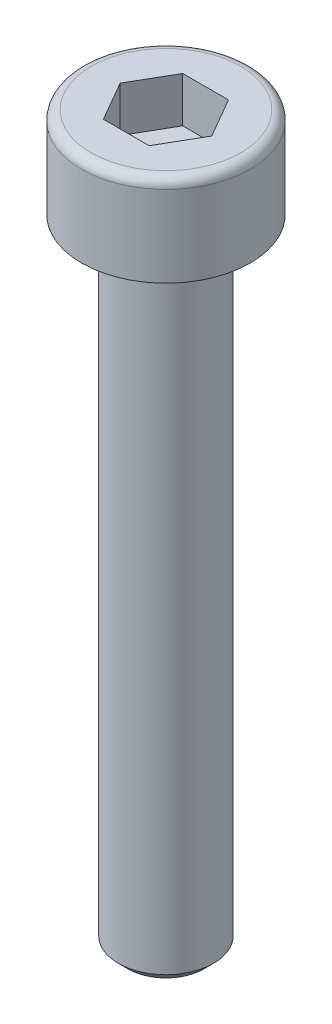
ISO-10303-21;
HEADER;
FILE_DESCRIPTION(('STEP AP214'),'2;1');
FILE_NAME('part.step','',(''),(''),'','','');
FILE_SCHEMA(('AUTOMOTIVE_DESIGN { 1 0 10303 214 1 1 1 1 }'));
ENDSEC;
DATA;
#1=APPLICATION_CONTEXT('core data for automotive mechanical design processes');
#2=APPLICATION_PROTOCOL_DEFINITION('international standard','automotive_design',2000,#1);
#3=PRODUCT_CONTEXT('',#1,'mechanical');
#4=PRODUCT('Part','Part','',(#3));
#5=PRODUCT_RELATED_PRODUCT_CATEGORY('part','',(#4));
#6=PRODUCT_DEFINITION_FORMATION('','',#4);
#7=PRODUCT_DEFINITION_CONTEXT('part definition',#1,'design');
#8=PRODUCT_DEFINITION('design','',#6,#7);
#9=PRODUCT_DEFINITION_SHAPE('','',#8);
#10=(LENGTH_UNIT() NAMED_UNIT(*) SI_UNIT(.MILLI.,.METRE.));
#11=(NAMED_UNIT(*) PLANE_ANGLE_UNIT() SI_UNIT($,.RADIAN.));
#12=(NAMED_UNIT(*) SI_UNIT($,.STERADIAN.) SOLID_ANGLE_UNIT());
#13=UNCERTAINTY_MEASURE_WITH_UNIT(LENGTH_MEASURE(1.E-05),#10,'distance_accuracy_value','');
#14=(GEOMETRIC_REPRESENTATION_CONTEXT(3) GLOBAL_UNCERTAINTY_ASSIGNED_CONTEXT((#13)) GLOBAL_UNIT_ASSIGNED_CONTEXT((#10,
#11,#12)) REPRESENTATION_CONTEXT('',''));
#15=CARTESIAN_POINT('',(0.,0.,0.));
#16=DIRECTION('',(0.,0.,1.));
#17=DIRECTION('',(1.,0.,0.));
#18=AXIS2_PLACEMENT_3D('',#15,#16,#17);
#19=CARTESIAN_POINT('',(1.5,-20.,0.));
#20=DIRECTION('',(0.,-1.,0.));
#21=DIRECTION('',(0.,0.,-1.));
#22=AXIS2_PLACEMENT_3D('',#19,#20,#21);
#23=PLANE('',#22);
#24=CARTESIAN_POINT('',(0.,-20.,0.));
#25=DIRECTION('',(0.,-1.,0.));
#26=DIRECTION('',(0.,0.,-1.));
#27=AXIS2_PLACEMENT_3D('',#24,#25,#26);
#28=CIRCLE('',#27,1.19999999999999);
#29=CARTESIAN_POINT('',(0.,-20.,-1.19999999999999));
#30=VERTEX_POINT('',#29);
#31=EDGE_CURVE('E148',#30,#30,#28,.T.);
#32=ORIENTED_EDGE('',*,*,#31,.T.);
#33=EDGE_LOOP('',(#32));
#34=FACE_BOUND('',#33,.T.);
#35=ADVANCED_FACE('F35',(#34),#23,.T.);
#36=CARTESIAN_POINT('',(0.,2.86,0.));
#37=DIRECTION('',(0.,1.,0.));
#38=DIRECTION('',(0.,0.,1.));
#39=AXIS2_PLACEMENT_3D('',#36,#37,#38);
#40=PLANE('',#39);
#41=DIRECTION('',(1.,0.,0.));
#42=VECTOR('',#41,1.);
#43=CARTESIAN_POINT('',(-0.721687836487032,2.86,1.25));
#44=LINE('',#43,#42);
#45=CARTESIAN_POINT('',(-0.721687836487032,2.86,1.25));
#46=VERTEX_POINT('',#45);
#47=CARTESIAN_POINT('',(0.721687836487033,2.86,1.25));
#48=VERTEX_POINT('',#47);
#49=EDGE_CURVE('E50',#46,#48,#44,.T.);
#50=ORIENTED_EDGE('',*,*,#49,.F.);
#51=DIRECTION('',(0.5,0.,0.866025403784439));
#52=VECTOR('',#51,1.);
#53=CARTESIAN_POINT('',(-1.44337567297406,2.86,0.));
#54=LINE('',#53,#52);
#55=CARTESIAN_POINT('',(-1.44337567297406,2.86,0.));
#56=VERTEX_POINT('',#55);
#57=EDGE_CURVE('E133',#56,#46,#54,.T.);
#58=ORIENTED_EDGE('',*,*,#57,.F.);
#59=DIRECTION('',(-0.5,0.,0.866025403784439));
#60=VECTOR('',#59,1.);
#61=CARTESIAN_POINT('',(-0.721687836487033,2.86,-1.25));
#62=LINE('',#61,#60);
#63=CARTESIAN_POINT('',(-0.721687836487033,2.86,-1.25));
#64=VERTEX_POINT('',#63);
#65=EDGE_CURVE('E131',#64,#56,#62,.T.);
#66=ORIENTED_EDGE('',*,*,#65,.F.);
#67=DIRECTION('',(-1.,0.,0.));
#68=VECTOR('',#67,1.);
#69=CARTESIAN_POINT('',(0.721687836487032,2.86,-1.25));
#70=LINE('',#69,#68);
#71=CARTESIAN_POINT('',(0.721687836487032,2.86,-1.25));
#72=VERTEX_POINT('',#71);
#73=EDGE_CURVE('E98',#72,#64,#70,.T.);
#74=ORIENTED_EDGE('',*,*,#73,.F.);
#75=DIRECTION('',(-0.5,0.,-0.866025403784438));
#76=VECTOR('',#75,1.);
#77=CARTESIAN_POINT('',(1.44337567297406,2.86,0.));
#78=LINE('',#77,#76);
#79=CARTESIAN_POINT('',(1.44337567297406,2.86,0.));
#80=VERTEX_POINT('',#79);
#81=EDGE_CURVE('E127',#80,#72,#78,.T.);
#82=ORIENTED_EDGE('',*,*,#81,.F.);
#83=DIRECTION('',(0.5,0.,-0.866025403784439));
#84=VECTOR('',#83,1.);
#85=CARTESIAN_POINT('',(0.721687836487033,2.86,1.25));
#86=LINE('',#85,#84);
#87=EDGE_CURVE('E124',#48,#80,#86,.T.);
#88=ORIENTED_EDGE('',*,*,#87,.F.);
#89=EDGE_LOOP('',(#50,#58,#66,#74,#82,#88));
#90=FACE_BOUND('',#89,.T.);
#91=CARTESIAN_POINT('',(0.,2.86,0.));
#92=DIRECTION('',(0.,1.,0.));
#93=DIRECTION('',(0.,0.,1.));
#94=AXIS2_PLACEMENT_3D('',#91,#92,#93);
#95=CIRCLE('',#94,2.36);
#96=CARTESIAN_POINT('',(0.,2.86,2.36));
#97=VERTEX_POINT('',#96);
#98=EDGE_CURVE('E11',#97,#97,#95,.T.);
#99=ORIENTED_EDGE('',*,*,#98,.T.);
#100=EDGE_LOOP('',(#99));
#101=FACE_BOUND('',#100,.T.);
#102=ADVANCED_FACE('F173',(#90,#101),#40,.T.);
#103=CARTESIAN_POINT('',(0.,2.86,0.));
#104=DIRECTION('',(0.,-1.,0.));
#105=DIRECTION('',(0.,0.,-1.));
#106=AXIS2_PLACEMENT_3D('',#103,#104,#105);
#107=CYLINDRICAL_SURFACE('',#106,2.66);
#108=CARTESIAN_POINT('',(0.,2.56,0.));
#109=DIRECTION('',(0.,1.,0.));
#110=DIRECTION('',(0.,0.,1.));
#111=AXIS2_PLACEMENT_3D('',#108,#109,#110);
#112=CIRCLE('',#111,2.66);
#113=CARTESIAN_POINT('',(0.,2.56,2.66));
#114=VERTEX_POINT('',#113);
#115=EDGE_CURVE('E43',#114,#114,#112,.F.);
#116=ORIENTED_EDGE('',*,*,#115,.T.);
#117=EDGE_LOOP('',(#116));
#118=FACE_BOUND('',#117,.T.);
#119=CARTESIAN_POINT('',(0.,0.,0.));
#120=DIRECTION('',(0.,-1.,0.));
#121=DIRECTION('',(0.,0.,-1.));
#122=AXIS2_PLACEMENT_3D('',#119,#120,#121);
#123=CIRCLE('',#122,2.66);
#124=CARTESIAN_POINT('',(0.,0.,-2.66));
#125=VERTEX_POINT('',#124);
#126=EDGE_CURVE('E145',#125,#125,#123,.T.);
#127=ORIENTED_EDGE('',*,*,#126,.F.);
#128=EDGE_LOOP('',(#127));
#129=FACE_BOUND('',#128,.T.);
#130=ADVANCED_FACE('F156',(#118,#129),#107,.T.);
#131=CARTESIAN_POINT('',(2.66,0.,0.));
#132=DIRECTION('',(0.,-1.,0.));
#133=DIRECTION('',(0.,0.,-1.));
#134=AXIS2_PLACEMENT_3D('',#131,#132,#133);
#135=PLANE('',#134);
#136=ORIENTED_EDGE('',*,*,#126,.T.);
#137=EDGE_LOOP('',(#136));
#138=FACE_BOUND('',#137,.T.);
#139=CARTESIAN_POINT('',(0.,0.,0.));
#140=DIRECTION('',(0.,-1.,0.));
#141=DIRECTION('',(0.,0.,-1.));
#142=AXIS2_PLACEMENT_3D('',#139,#140,#141);
#143=CIRCLE('',#142,1.5);
#144=CARTESIAN_POINT('',(0.,0.,-1.5));
#145=VERTEX_POINT('',#144);
#146=EDGE_CURVE('E137',#145,#145,#143,.T.);
#147=ORIENTED_EDGE('',*,*,#146,.F.);
#148=EDGE_LOOP('',(#147));
#149=FACE_BOUND('',#148,.T.);
#150=ADVANCED_FACE('F184',(#138,#149),#135,.T.);
#151=CARTESIAN_POINT('',(0.,2.86,0.));
#152=DIRECTION('',(0.,-1.,0.));
#153=DIRECTION('',(0.,0.,-1.));
#154=AXIS2_PLACEMENT_3D('',#151,#152,#153);
#155=CYLINDRICAL_SURFACE('',#154,1.5);
#156=CARTESIAN_POINT('',(0.,-19.7,0.));
#157=DIRECTION('',(0.,-1.,0.));
#158=DIRECTION('',(0.,0.,-1.));
#159=AXIS2_PLACEMENT_3D('',#156,#157,#158);
#160=CIRCLE('',#159,1.5);
#161=CARTESIAN_POINT('',(0.,-19.7,-1.5));
#162=VERTEX_POINT('',#161);
#163=EDGE_CURVE('E151',#162,#162,#160,.F.);
#164=ORIENTED_EDGE('',*,*,#163,.T.);
#165=EDGE_LOOP('',(#164));
#166=FACE_BOUND('',#165,.T.);
#167=ORIENTED_EDGE('',*,*,#146,.T.);
#168=EDGE_LOOP('',(#167));
#169=FACE_BOUND('',#168,.T.);
#170=ADVANCED_FACE('F169',(#166,#169),#155,.T.);
#171=CARTESIAN_POINT('',(0.,-20.,0.));
#172=DIRECTION('',(0.,1.,0.));
#173=DIRECTION('',(0.,0.,1.));
#174=AXIS2_PLACEMENT_3D('',#171,#172,#173);
#175=CONICAL_SURFACE('',#174,1.2,0.785398163397443);
#176=ORIENTED_EDGE('',*,*,#163,.F.);
#177=EDGE_LOOP('',(#176));
#178=FACE_BOUND('',#177,.T.);
#179=ORIENTED_EDGE('',*,*,#31,.F.);
#180=EDGE_LOOP('',(#179));
#181=FACE_BOUND('',#180,.T.);
#182=ADVANCED_FACE('F161',(#178,#181),#175,.T.);
#183=CARTESIAN_POINT('',(0.,2.56,0.));
#184=DIRECTION('',(0.,1.,0.));
#185=DIRECTION('',(0.,0.,1.));
#186=AXIS2_PLACEMENT_3D('',#183,#184,#185);
#187=TOROIDAL_SURFACE('',#186,2.36,0.3);
#188=ORIENTED_EDGE('',*,*,#98,.F.);
#189=EDGE_LOOP('',(#188));
#190=FACE_BOUND('',#189,.T.);
#191=ORIENTED_EDGE('',*,*,#115,.F.);
#192=EDGE_LOOP('',(#191));
#193=FACE_BOUND('',#192,.T.);
#194=ADVANCED_FACE('F37',(#190,#193),#187,.T.);
#195=CARTESIAN_POINT('',(-0.721687836487032,1.43,1.25));
#196=DIRECTION('',(0.,0.,1.));
#197=DIRECTION('',(1.,0.,0.));
#198=AXIS2_PLACEMENT_3D('',#195,#196,#197);
#199=PLANE('',#198);
#200=ORIENTED_EDGE('',*,*,#49,.T.);
#201=DIRECTION('',(0.,1.,0.));
#202=VECTOR('',#201,1.);
#203=CARTESIAN_POINT('',(0.721687836487033,1.43,1.25));
#204=LINE('',#203,#202);
#205=CARTESIAN_POINT('',(0.721687836487033,1.43,1.25));
#206=VERTEX_POINT('',#205);
#207=EDGE_CURVE('E80',#206,#48,#204,.T.);
#208=ORIENTED_EDGE('',*,*,#207,.F.);
#209=DIRECTION('',(1.,0.,0.));
#210=VECTOR('',#209,1.);
#211=CARTESIAN_POINT('',(-0.721687836487032,1.43,1.25));
#212=LINE('',#211,#210);
#213=CARTESIAN_POINT('',(-0.721687836487032,1.43,1.25));
#214=VERTEX_POINT('',#213);
#215=EDGE_CURVE('E135',#214,#206,#212,.T.);
#216=ORIENTED_EDGE('',*,*,#215,.F.);
#217=DIRECTION('',(0.,1.,0.));
#218=VECTOR('',#217,1.);
#219=CARTESIAN_POINT('',(-0.721687836487032,1.43,1.25));
#220=LINE('',#219,#218);
#221=EDGE_CURVE('E58',#214,#46,#220,.T.);
#222=ORIENTED_EDGE('',*,*,#221,.T.);
#223=EDGE_LOOP('',(#200,#208,#216,#222));
#224=FACE_BOUND('',#223,.T.);
#225=ADVANCED_FACE('F160',(#224),#199,.F.);
#226=CARTESIAN_POINT('',(-1.44337567297406,1.43,0.));
#227=DIRECTION('',(-0.866025403784439,0.,0.5));
#228=DIRECTION('',(0.5,0.,0.866025403784439));
#229=AXIS2_PLACEMENT_3D('',#226,#227,#228);
#230=PLANE('',#229);
#231=ORIENTED_EDGE('',*,*,#57,.T.);
#232=ORIENTED_EDGE('',*,*,#221,.F.);
#233=DIRECTION('',(0.5,0.,0.866025403784439));
#234=VECTOR('',#233,1.);
#235=CARTESIAN_POINT('',(-1.44337567297406,1.43,0.));
#236=LINE('',#235,#234);
#237=CARTESIAN_POINT('',(-1.44337567297406,1.43,0.));
#238=VERTEX_POINT('',#237);
#239=EDGE_CURVE('E110',#238,#214,#236,.T.);
#240=ORIENTED_EDGE('',*,*,#239,.F.);
#241=DIRECTION('',(0.,1.,0.));
#242=VECTOR('',#241,1.);
#243=CARTESIAN_POINT('',(-1.44337567297406,1.43,0.));
#244=LINE('',#243,#242);
#245=EDGE_CURVE('E102',#238,#56,#244,.T.);
#246=ORIENTED_EDGE('',*,*,#245,.T.);
#247=EDGE_LOOP('',(#231,#232,#240,#246));
#248=FACE_BOUND('',#247,.T.);
#249=ADVANCED_FACE('F167',(#248),#230,.F.);
#250=CARTESIAN_POINT('',(-0.721687836487033,1.43,-1.25));
#251=DIRECTION('',(-0.866025403784439,0.,-0.5));
#252=DIRECTION('',(-0.5,0.,0.866025403784439));
#253=AXIS2_PLACEMENT_3D('',#250,#251,#252);
#254=PLANE('',#253);
#255=ORIENTED_EDGE('',*,*,#65,.T.);
#256=ORIENTED_EDGE('',*,*,#245,.F.);
#257=DIRECTION('',(-0.5,0.,0.866025403784439));
#258=VECTOR('',#257,1.);
#259=CARTESIAN_POINT('',(-0.721687836487033,1.43,-1.25));
#260=LINE('',#259,#258);
#261=CARTESIAN_POINT('',(-0.721687836487033,1.43,-1.25));
#262=VERTEX_POINT('',#261);
#263=EDGE_CURVE('E106',#262,#238,#260,.T.);
#264=ORIENTED_EDGE('',*,*,#263,.F.);
#265=DIRECTION('',(0.,1.,0.));
#266=VECTOR('',#265,1.);
#267=CARTESIAN_POINT('',(-0.721687836487033,1.43,-1.25));
#268=LINE('',#267,#266);
#269=EDGE_CURVE('E91',#262,#64,#268,.T.);
#270=ORIENTED_EDGE('',*,*,#269,.T.);
#271=EDGE_LOOP('',(#255,#256,#264,#270));
#272=FACE_BOUND('',#271,.T.);
#273=ADVANCED_FACE('F107',(#272),#254,.F.);
#274=CARTESIAN_POINT('',(0.721687836487032,1.43,-1.25));
#275=DIRECTION('',(0.,0.,-1.));
#276=DIRECTION('',(-1.,0.,0.));
#277=AXIS2_PLACEMENT_3D('',#274,#275,#276);
#278=PLANE('',#277);
#279=ORIENTED_EDGE('',*,*,#73,.T.);
#280=ORIENTED_EDGE('',*,*,#269,.F.);
#281=DIRECTION('',(-1.,0.,0.));
#282=VECTOR('',#281,1.);
#283=CARTESIAN_POINT('',(0.721687836487032,1.43,-1.25));
#284=LINE('',#283,#282);
#285=CARTESIAN_POINT('',(0.721687836487032,1.43,-1.25));
#286=VERTEX_POINT('',#285);
#287=EDGE_CURVE('E95',#286,#262,#284,.T.);
#288=ORIENTED_EDGE('',*,*,#287,.F.);
#289=DIRECTION('',(0.,1.,0.));
#290=VECTOR('',#289,1.);
#291=CARTESIAN_POINT('',(0.721687836487032,1.43,-1.25));
#292=LINE('',#291,#290);
#293=EDGE_CURVE('E103',#286,#72,#292,.T.);
#294=ORIENTED_EDGE('',*,*,#293,.T.);
#295=EDGE_LOOP('',(#279,#280,#288,#294));
#296=FACE_BOUND('',#295,.T.);
#297=ADVANCED_FACE('F93',(#296),#278,.F.);
#298=CARTESIAN_POINT('',(1.44337567297406,1.43,0.));
#299=DIRECTION('',(0.866025403784438,0.,-0.5));
#300=DIRECTION('',(-0.5,0.,-0.866025403784438));
#301=AXIS2_PLACEMENT_3D('',#298,#299,#300);
#302=PLANE('',#301);
#303=ORIENTED_EDGE('',*,*,#81,.T.);
#304=ORIENTED_EDGE('',*,*,#293,.F.);
#305=DIRECTION('',(-0.5,0.,-0.866025403784438));
#306=VECTOR('',#305,1.);
#307=CARTESIAN_POINT('',(1.44337567297406,1.43,0.));
#308=LINE('',#307,#306);
#309=CARTESIAN_POINT('',(1.44337567297406,1.43,0.));
#310=VERTEX_POINT('',#309);
#311=EDGE_CURVE('E116',#310,#286,#308,.T.);
#312=ORIENTED_EDGE('',*,*,#311,.F.);
#313=DIRECTION('',(0.,1.,0.));
#314=VECTOR('',#313,1.);
#315=CARTESIAN_POINT('',(1.44337567297406,1.43,0.));
#316=LINE('',#315,#314);
#317=EDGE_CURVE('E140',#310,#80,#316,.T.);
#318=ORIENTED_EDGE('',*,*,#317,.T.);
#319=EDGE_LOOP('',(#303,#304,#312,#318));
#320=FACE_BOUND('',#319,.T.);
#321=ADVANCED_FACE('F194',(#320),#302,.F.);
#322=CARTESIAN_POINT('',(0.721687836487033,1.43,1.25));
#323=DIRECTION('',(0.866025403784439,0.,0.5));
#324=DIRECTION('',(0.5,0.,-0.866025403784439));
#325=AXIS2_PLACEMENT_3D('',#322,#323,#324);
#326=PLANE('',#325);
#327=ORIENTED_EDGE('',*,*,#87,.T.);
#328=ORIENTED_EDGE('',*,*,#317,.F.);
#329=DIRECTION('',(0.5,0.,-0.866025403784439));
#330=VECTOR('',#329,1.);
#331=CARTESIAN_POINT('',(0.721687836487033,1.43,1.25));
#332=LINE('',#331,#330);
#333=EDGE_CURVE('E118',#206,#310,#332,.T.);
#334=ORIENTED_EDGE('',*,*,#333,.F.);
#335=ORIENTED_EDGE('',*,*,#207,.T.);
#336=EDGE_LOOP('',(#327,#328,#334,#335));
#337=FACE_BOUND('',#336,.T.);
#338=ADVANCED_FACE('F191',(#337),#326,.F.);
#339=CARTESIAN_POINT('',(0.,1.43,0.));
#340=DIRECTION('',(0.,1.,0.));
#341=DIRECTION('',(0.,0.,1.));
#342=AXIS2_PLACEMENT_3D('',#339,#340,#341);
#343=PLANE('',#342);
#344=ORIENTED_EDGE('',*,*,#215,.T.);
#345=ORIENTED_EDGE('',*,*,#333,.T.);
#346=ORIENTED_EDGE('',*,*,#311,.T.);
#347=ORIENTED_EDGE('',*,*,#287,.T.);
#348=ORIENTED_EDGE('',*,*,#263,.T.);
#349=ORIENTED_EDGE('',*,*,#239,.T.);
#350=EDGE_LOOP('',(#344,#345,#346,#347,#348,#349));
#351=FACE_BOUND('',#350,.T.);
#352=ADVANCED_FACE('F113',(#351),#343,.T.);
#353=CLOSED_SHELL('',(#35,#102,#130,#150,#170,#182,#194,#225,#249,#273,#297,#321,#338,#352));
#354=MANIFOLD_SOLID_BREP('B2',#353);
#355=ADVANCED_BREP_SHAPE_REPRESENTATION('',(#18,#354),#14);
#356=SHAPE_DEFINITION_REPRESENTATION(#9,#355);
ENDSEC;
END-ISO-10303-21;
